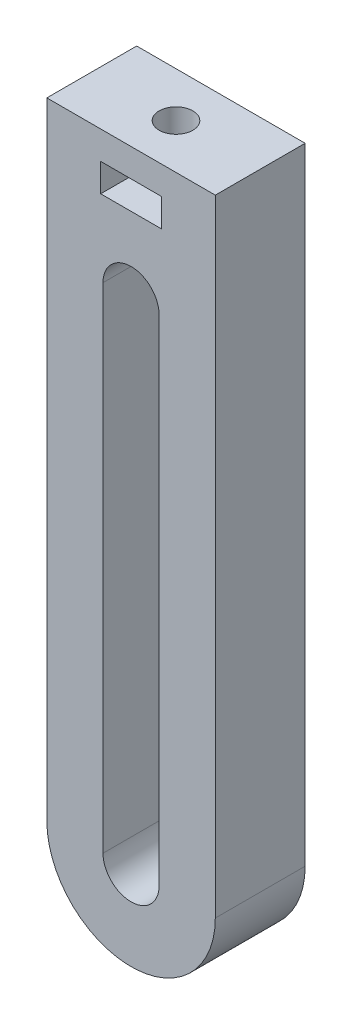
ISO-10303-21;
HEADER;
FILE_DESCRIPTION(('STEP AP214'),'2;1');
FILE_NAME('part.step','',(''),(''),'','','');
FILE_SCHEMA(('AUTOMOTIVE_DESIGN { 1 0 10303 214 1 1 1 1 }'));
ENDSEC;
DATA;
#1=APPLICATION_CONTEXT('core data for automotive mechanical design processes');
#2=APPLICATION_PROTOCOL_DEFINITION('international standard','automotive_design',2000,#1);
#3=PRODUCT_CONTEXT('',#1,'mechanical');
#4=PRODUCT('Part','Part','',(#3));
#5=PRODUCT_RELATED_PRODUCT_CATEGORY('part','',(#4));
#6=PRODUCT_DEFINITION_FORMATION('','',#4);
#7=PRODUCT_DEFINITION_CONTEXT('part definition',#1,'design');
#8=PRODUCT_DEFINITION('design','',#6,#7);
#9=PRODUCT_DEFINITION_SHAPE('','',#8);
#10=(LENGTH_UNIT() NAMED_UNIT(*) SI_UNIT(.MILLI.,.METRE.));
#11=(NAMED_UNIT(*) PLANE_ANGLE_UNIT() SI_UNIT($,.RADIAN.));
#12=(NAMED_UNIT(*) SI_UNIT($,.STERADIAN.) SOLID_ANGLE_UNIT());
#13=UNCERTAINTY_MEASURE_WITH_UNIT(LENGTH_MEASURE(1.E-05),#10,'distance_accuracy_value','');
#14=(GEOMETRIC_REPRESENTATION_CONTEXT(3) GLOBAL_UNCERTAINTY_ASSIGNED_CONTEXT((#13)) GLOBAL_UNIT_ASSIGNED_CONTEXT((#10,
#11,#12)) REPRESENTATION_CONTEXT('',''));
#15=CARTESIAN_POINT('',(0.,0.,0.));
#16=DIRECTION('',(0.,0.,1.));
#17=DIRECTION('',(1.,0.,0.));
#18=AXIS2_PLACEMENT_3D('',#15,#16,#17);
#19=CARTESIAN_POINT('',(0.,-22.,8.));
#20=DIRECTION('',(0.,0.,-1.));
#21=DIRECTION('',(-1.,0.,0.));
#22=AXIS2_PLACEMENT_3D('',#19,#20,#21);
#23=PLANE('',#22);
#24=DIRECTION('',(-1.,0.,0.));
#25=VECTOR('',#24,1.);
#26=CARTESIAN_POINT('',(-2.70500000000001,31.25,8.));
#27=LINE('',#26,#25);
#28=CARTESIAN_POINT('',(2.70499999999999,31.25,8.));
#29=VERTEX_POINT('',#28);
#30=CARTESIAN_POINT('',(-2.70500000000001,31.25,8.));
#31=VERTEX_POINT('',#30);
#32=EDGE_CURVE('E142',#29,#31,#27,.T.);
#33=ORIENTED_EDGE('',*,*,#32,.F.);
#34=DIRECTION('',(0.,1.,0.));
#35=VECTOR('',#34,1.);
#36=CARTESIAN_POINT('',(2.70499999999999,31.25,8.));
#37=LINE('',#36,#35);
#38=CARTESIAN_POINT('',(2.70499999999999,28.75,8.));
#39=VERTEX_POINT('',#38);
#40=EDGE_CURVE('E146',#39,#29,#37,.T.);
#41=ORIENTED_EDGE('',*,*,#40,.F.);
#42=DIRECTION('',(1.,0.,0.));
#43=VECTOR('',#42,1.);
#44=CARTESIAN_POINT('',(-2.70500000000001,28.75,8.));
#45=LINE('',#44,#43);
#46=CARTESIAN_POINT('',(-2.70500000000001,28.75,8.));
#47=VERTEX_POINT('',#46);
#48=EDGE_CURVE('E150',#47,#39,#45,.T.);
#49=ORIENTED_EDGE('',*,*,#48,.F.);
#50=DIRECTION('',(0.,-1.,0.));
#51=VECTOR('',#50,1.);
#52=CARTESIAN_POINT('',(-2.70500000000001,31.25,8.));
#53=LINE('',#52,#51);
#54=EDGE_CURVE('E133',#31,#47,#53,.T.);
#55=ORIENTED_EDGE('',*,*,#54,.F.);
#56=EDGE_LOOP('',(#33,#41,#49,#55));
#57=FACE_BOUND('',#56,.T.);
#58=DIRECTION('',(0.,1.,0.));
#59=VECTOR('',#58,1.);
#60=CARTESIAN_POINT('',(7.5,-22.,8.));
#61=LINE('',#60,#59);
#62=CARTESIAN_POINT('',(7.5,-22.,8.));
#63=VERTEX_POINT('',#62);
#64=CARTESIAN_POINT('',(7.5,33.75,8.));
#65=VERTEX_POINT('',#64);
#66=EDGE_CURVE('E205',#63,#65,#61,.T.);
#67=ORIENTED_EDGE('',*,*,#66,.T.);
#68=DIRECTION('',(-1.,0.,0.));
#69=VECTOR('',#68,1.);
#70=CARTESIAN_POINT('',(-7.5,33.75,8.));
#71=LINE('',#70,#69);
#72=CARTESIAN_POINT('',(-7.5,33.75,8.));
#73=VERTEX_POINT('',#72);
#74=EDGE_CURVE('E208',#65,#73,#71,.T.);
#75=ORIENTED_EDGE('',*,*,#74,.T.);
#76=DIRECTION('',(0.,-1.,0.));
#77=VECTOR('',#76,1.);
#78=CARTESIAN_POINT('',(-7.5,33.75,8.));
#79=LINE('',#78,#77);
#80=CARTESIAN_POINT('',(-7.5,-22.,8.));
#81=VERTEX_POINT('',#80);
#82=EDGE_CURVE('E211',#73,#81,#79,.T.);
#83=ORIENTED_EDGE('',*,*,#82,.T.);
#84=CARTESIAN_POINT('',(0.,-22.,8.));
#85=DIRECTION('',(0.,0.,1.));
#86=DIRECTION('',(-1.,0.,0.));
#87=AXIS2_PLACEMENT_3D('',#84,#85,#86);
#88=CIRCLE('',#87,7.5);
#89=EDGE_CURVE('E213',#81,#63,#88,.T.);
#90=ORIENTED_EDGE('',*,*,#89,.T.);
#91=EDGE_LOOP('',(#67,#75,#83,#90));
#92=FACE_BOUND('',#91,.T.);
#93=CARTESIAN_POINT('',(0.,22.,8.));
#94=DIRECTION('',(0.,0.,1.));
#95=DIRECTION('',(1.,0.,0.));
#96=AXIS2_PLACEMENT_3D('',#93,#94,#95);
#97=CIRCLE('',#96,2.49999999999999);
#98=CARTESIAN_POINT('',(2.49999999999998,22.,8.));
#99=VERTEX_POINT('',#98);
#100=CARTESIAN_POINT('',(-2.5,22.,8.));
#101=VERTEX_POINT('',#100);
#102=EDGE_CURVE('E176',#99,#101,#97,.T.);
#103=ORIENTED_EDGE('',*,*,#102,.F.);
#104=DIRECTION('',(0.,1.,0.));
#105=VECTOR('',#104,1.);
#106=CARTESIAN_POINT('',(2.49999999999998,22.,8.));
#107=LINE('',#106,#105);
#108=CARTESIAN_POINT('',(2.5,-22.,8.));
#109=VERTEX_POINT('',#108);
#110=EDGE_CURVE('E183',#109,#99,#107,.T.);
#111=ORIENTED_EDGE('',*,*,#110,.F.);
#112=CARTESIAN_POINT('',(0.,-22.,8.));
#113=DIRECTION('',(0.,0.,1.));
#114=DIRECTION('',(1.,0.,0.));
#115=AXIS2_PLACEMENT_3D('',#112,#113,#114);
#116=CIRCLE('',#115,2.49999999999999);
#117=CARTESIAN_POINT('',(-2.49999999999999,-22.,8.));
#118=VERTEX_POINT('',#117);
#119=EDGE_CURVE('E181',#118,#109,#116,.T.);
#120=ORIENTED_EDGE('',*,*,#119,.F.);
#121=DIRECTION('',(0.,-1.,0.));
#122=VECTOR('',#121,1.);
#123=CARTESIAN_POINT('',(-2.5,22.,8.));
#124=LINE('',#123,#122);
#125=EDGE_CURVE('E178',#101,#118,#124,.T.);
#126=ORIENTED_EDGE('',*,*,#125,.F.);
#127=EDGE_LOOP('',(#103,#111,#120,#126));
#128=FACE_BOUND('',#127,.T.);
#129=ADVANCED_FACE('F32',(#57,#92,#128),#23,.F.);
#130=CARTESIAN_POINT('',(0.,-22.,0.));
#131=DIRECTION('',(0.,0.,-1.));
#132=DIRECTION('',(-1.,0.,0.));
#133=AXIS2_PLACEMENT_3D('',#130,#131,#132);
#134=PLANE('',#133);
#135=DIRECTION('',(0.,1.,0.));
#136=VECTOR('',#135,1.);
#137=CARTESIAN_POINT('',(7.5,-22.,0.));
#138=LINE('',#137,#136);
#139=CARTESIAN_POINT('',(7.5,-22.,0.));
#140=VERTEX_POINT('',#139);
#141=CARTESIAN_POINT('',(7.5,33.75,0.));
#142=VERTEX_POINT('',#141);
#143=EDGE_CURVE('E204',#140,#142,#138,.T.);
#144=ORIENTED_EDGE('',*,*,#143,.F.);
#145=CARTESIAN_POINT('',(0.,-22.,0.));
#146=DIRECTION('',(0.,0.,1.));
#147=DIRECTION('',(-1.,0.,0.));
#148=AXIS2_PLACEMENT_3D('',#145,#146,#147);
#149=CIRCLE('',#148,7.5);
#150=CARTESIAN_POINT('',(-7.5,-22.,0.));
#151=VERTEX_POINT('',#150);
#152=EDGE_CURVE('E209',#151,#140,#149,.T.);
#153=ORIENTED_EDGE('',*,*,#152,.F.);
#154=DIRECTION('',(0.,-1.,0.));
#155=VECTOR('',#154,1.);
#156=CARTESIAN_POINT('',(-7.5,33.75,0.));
#157=LINE('',#156,#155);
#158=CARTESIAN_POINT('',(-7.5,33.75,0.));
#159=VERTEX_POINT('',#158);
#160=EDGE_CURVE('E220',#159,#151,#157,.T.);
#161=ORIENTED_EDGE('',*,*,#160,.F.);
#162=DIRECTION('',(-1.,0.,0.));
#163=VECTOR('',#162,1.);
#164=CARTESIAN_POINT('',(-7.5,33.75,0.));
#165=LINE('',#164,#163);
#166=EDGE_CURVE('E218',#142,#159,#165,.T.);
#167=ORIENTED_EDGE('',*,*,#166,.F.);
#168=EDGE_LOOP('',(#144,#153,#161,#167));
#169=FACE_BOUND('',#168,.T.);
#170=DIRECTION('',(0.,1.,0.));
#171=VECTOR('',#170,1.);
#172=CARTESIAN_POINT('',(2.49999999999998,22.,0.));
#173=LINE('',#172,#171);
#174=CARTESIAN_POINT('',(2.5,-22.,0.));
#175=VERTEX_POINT('',#174);
#176=CARTESIAN_POINT('',(2.49999999999998,22.,0.));
#177=VERTEX_POINT('',#176);
#178=EDGE_CURVE('E179',#175,#177,#173,.T.);
#179=ORIENTED_EDGE('',*,*,#178,.T.);
#180=CARTESIAN_POINT('',(0.,22.,0.));
#181=DIRECTION('',(0.,0.,1.));
#182=DIRECTION('',(1.,0.,0.));
#183=AXIS2_PLACEMENT_3D('',#180,#181,#182);
#184=CIRCLE('',#183,2.49999999999999);
#185=CARTESIAN_POINT('',(-2.5,22.,0.));
#186=VERTEX_POINT('',#185);
#187=EDGE_CURVE('E171',#177,#186,#184,.T.);
#188=ORIENTED_EDGE('',*,*,#187,.T.);
#189=DIRECTION('',(0.,-1.,0.));
#190=VECTOR('',#189,1.);
#191=CARTESIAN_POINT('',(-2.5,22.,0.));
#192=LINE('',#191,#190);
#193=CARTESIAN_POINT('',(-2.49999999999999,-22.,0.));
#194=VERTEX_POINT('',#193);
#195=EDGE_CURVE('E188',#186,#194,#192,.T.);
#196=ORIENTED_EDGE('',*,*,#195,.T.);
#197=CARTESIAN_POINT('',(0.,-22.,0.));
#198=DIRECTION('',(0.,0.,1.));
#199=DIRECTION('',(1.,0.,0.));
#200=AXIS2_PLACEMENT_3D('',#197,#198,#199);
#201=CIRCLE('',#200,2.49999999999999);
#202=EDGE_CURVE('E191',#194,#175,#201,.T.);
#203=ORIENTED_EDGE('',*,*,#202,.T.);
#204=EDGE_LOOP('',(#179,#188,#196,#203));
#205=FACE_BOUND('',#204,.T.);
#206=ADVANCED_FACE('F239',(#169,#205),#134,.T.);
#207=CARTESIAN_POINT('',(7.5,-22.,8.));
#208=DIRECTION('',(-1.,0.,0.));
#209=DIRECTION('',(0.,0.,1.));
#210=AXIS2_PLACEMENT_3D('',#207,#208,#209);
#211=PLANE('',#210);
#212=ORIENTED_EDGE('',*,*,#143,.T.);
#213=DIRECTION('',(0.,0.,-1.));
#214=VECTOR('',#213,1.);
#215=CARTESIAN_POINT('',(7.5,33.75,8.));
#216=LINE('',#215,#214);
#217=EDGE_CURVE('E11',#65,#142,#216,.T.);
#218=ORIENTED_EDGE('',*,*,#217,.F.);
#219=ORIENTED_EDGE('',*,*,#66,.F.);
#220=DIRECTION('',(0.,0.,-1.));
#221=VECTOR('',#220,1.);
#222=CARTESIAN_POINT('',(7.5,-22.,8.));
#223=LINE('',#222,#221);
#224=EDGE_CURVE('E215',#63,#140,#223,.T.);
#225=ORIENTED_EDGE('',*,*,#224,.T.);
#226=EDGE_LOOP('',(#212,#218,#219,#225));
#227=FACE_BOUND('',#226,.T.);
#228=ADVANCED_FACE('F34',(#227),#211,.F.);
#229=CARTESIAN_POINT('',(-7.5,33.75,8.));
#230=DIRECTION('',(0.,-1.,0.));
#231=DIRECTION('',(0.,0.,-1.));
#232=AXIS2_PLACEMENT_3D('',#229,#230,#231);
#233=PLANE('',#232);
#234=CARTESIAN_POINT('',(0.,33.75,4.));
#235=DIRECTION('',(0.,1.,0.));
#236=DIRECTION('',(0.,0.,1.));
#237=AXIS2_PLACEMENT_3D('',#234,#235,#236);
#238=CIRCLE('',#237,1.5);
#239=CARTESIAN_POINT('',(0.,33.75,5.5));
#240=VERTEX_POINT('',#239);
#241=EDGE_CURVE('E332',#240,#240,#238,.T.);
#242=ORIENTED_EDGE('',*,*,#241,.F.);
#243=EDGE_LOOP('',(#242));
#244=FACE_BOUND('',#243,.T.);
#245=ORIENTED_EDGE('',*,*,#166,.T.);
#246=DIRECTION('',(0.,0.,-1.));
#247=VECTOR('',#246,1.);
#248=CARTESIAN_POINT('',(-7.5,33.75,8.));
#249=LINE('',#248,#247);
#250=EDGE_CURVE('E41',#73,#159,#249,.T.);
#251=ORIENTED_EDGE('',*,*,#250,.F.);
#252=ORIENTED_EDGE('',*,*,#74,.F.);
#253=ORIENTED_EDGE('',*,*,#217,.T.);
#254=EDGE_LOOP('',(#245,#251,#252,#253));
#255=FACE_BOUND('',#254,.T.);
#256=ADVANCED_FACE('F249',(#244,#255),#233,.F.);
#257=CARTESIAN_POINT('',(-7.5,33.75,8.));
#258=DIRECTION('',(1.,0.,0.));
#259=DIRECTION('',(0.,0.,-1.));
#260=AXIS2_PLACEMENT_3D('',#257,#258,#259);
#261=PLANE('',#260);
#262=ORIENTED_EDGE('',*,*,#160,.T.);
#263=DIRECTION('',(0.,0.,-1.));
#264=VECTOR('',#263,1.);
#265=CARTESIAN_POINT('',(-7.5,-22.,8.));
#266=LINE('',#265,#264);
#267=EDGE_CURVE('E225',#81,#151,#266,.T.);
#268=ORIENTED_EDGE('',*,*,#267,.F.);
#269=ORIENTED_EDGE('',*,*,#82,.F.);
#270=ORIENTED_EDGE('',*,*,#250,.T.);
#271=EDGE_LOOP('',(#262,#268,#269,#270));
#272=FACE_BOUND('',#271,.T.);
#273=ADVANCED_FACE('F233',(#272),#261,.F.);
#274=CARTESIAN_POINT('',(0.,-22.,8.));
#275=DIRECTION('',(0.,0.,-1.));
#276=DIRECTION('',(-1.,0.,0.));
#277=AXIS2_PLACEMENT_3D('',#274,#275,#276);
#278=CYLINDRICAL_SURFACE('',#277,7.5);
#279=ORIENTED_EDGE('',*,*,#152,.T.);
#280=ORIENTED_EDGE('',*,*,#224,.F.);
#281=ORIENTED_EDGE('',*,*,#89,.F.);
#282=ORIENTED_EDGE('',*,*,#267,.T.);
#283=EDGE_LOOP('',(#279,#280,#281,#282));
#284=FACE_BOUND('',#283,.T.);
#285=ADVANCED_FACE('F243',(#284),#278,.T.);
#286=CARTESIAN_POINT('',(0.,22.,8.));
#287=DIRECTION('',(0.,0.,-1.));
#288=DIRECTION('',(-1.,0.,0.));
#289=AXIS2_PLACEMENT_3D('',#286,#287,#288);
#290=CYLINDRICAL_SURFACE('',#289,2.49999999999999);
#291=CARTESIAN_POINT('',(0.,24.5,5.5));
#292=CARTESIAN_POINT('',(0.076729833462016,24.4999962578973,5.49999590899012));
#293=CARTESIAN_POINT('',(0.153582320644178,24.4964290461501,5.49407132907374));
#294=CARTESIAN_POINT('',(0.304975509530679,24.4824990360857,5.47067568048467));
#295=CARTESIAN_POINT('',(0.379510034596047,24.4721194803272,5.45317613814577));
#296=CARTESIAN_POINT('',(0.523751827790837,24.4456155805449,5.40761363883314));
#297=CARTESIAN_POINT('',(0.593481028226566,24.4295197327294,5.37960304183684));
#298=CARTESIAN_POINT('',(0.727030318214659,24.3929536762641,5.31413966685897));
#299=CARTESIAN_POINT('',(0.790851869416383,24.3724845538025,5.27668923303125));
#300=CARTESIAN_POINT('',(0.916299278999315,24.3270536071909,5.19022517329142));
#301=CARTESIAN_POINT('',(0.977384020081416,24.3018679219598,5.14054630464861));
#302=CARTESIAN_POINT('',(1.09088270411891,24.2503043927963,5.03253279617173));
#303=CARTESIAN_POINT('',(1.14328534948112,24.2239250515357,4.97418706281268));
#304=CARTESIAN_POINT('',(1.24444996762974,24.1691106699591,4.84207648950327));
#305=CARTESIAN_POINT('',(1.29197766378809,24.1408201770365,4.76729822901871));
#306=CARTESIAN_POINT('',(1.37361437764896,24.0893830141212,4.60915342675689));
#307=CARTESIAN_POINT('',(1.4077451733516,24.0662280227394,4.52580110375243));
#308=CARTESIAN_POINT('',(1.45440601714221,24.0335462966093,4.37340354934676));
#309=CARTESIAN_POINT('',(1.47016197246826,24.0220788313759,4.30576400138969));
#310=CARTESIAN_POINT('',(1.49216172340475,24.005903082955,4.16819628416964));
#311=CARTESIAN_POINT('',(1.49841734556836,24.0011863964376,4.09827107124551));
#312=CARTESIAN_POINT('',(1.50105508796009,23.9992092246385,3.95798850578267));
#313=CARTESIAN_POINT('',(1.49741783408419,24.0019633701272,3.88763057490681));
#314=CARTESIAN_POINT('',(1.48046060478828,24.0145326144374,3.74872122457242));
#315=CARTESIAN_POINT('',(1.46713334620103,24.0243530243222,3.68017120415256));
#316=CARTESIAN_POINT('',(1.43173921881793,24.0495318694426,3.5474697578719));
#317=CARTESIAN_POINT('',(1.40978748666087,24.0648171165254,3.48327294607552));
#318=CARTESIAN_POINT('',(1.35795061770837,24.0992705135083,3.35930500907188));
#319=CARTESIAN_POINT('',(1.32806257259705,24.1184400862346,3.29953551657608));
#320=CARTESIAN_POINT('',(1.25517983184583,24.1625532726898,3.1750159028772));
#321=CARTESIAN_POINT('',(1.21080724397723,24.1879204337299,3.11122190704508));
#322=CARTESIAN_POINT('',(1.11291092784003,24.2393059976438,2.99132351633299));
#323=CARTESIAN_POINT('',(1.05937845100579,24.2653250026215,2.9352265660235));
#324=CARTESIAN_POINT('',(0.935811834382973,24.3193550495832,2.82438701817825));
#325=CARTESIAN_POINT('',(0.864517682704964,24.3471383626853,2.77092269398402));
#326=CARTESIAN_POINT('',(0.712276050459008,24.3977242843398,2.67687795280209));
#327=CARTESIAN_POINT('',(0.631333763943572,24.4205295542551,2.63629064621005));
#328=CARTESIAN_POINT('',(0.467197585268214,24.4573039206615,2.5720678172041));
#329=CARTESIAN_POINT('',(0.384467624173588,24.471739574397,2.54752464428409));
#330=CARTESIAN_POINT('',(0.215047895144647,24.4921884281355,2.51298880259462));
#331=CARTESIAN_POINT('',(0.128363005661326,24.4982117295274,2.50297868224643));
#332=CARTESIAN_POINT('',(-0.0337146143773894,24.5009057037461,2.49849215232169));
#333=CARTESIAN_POINT('',(-0.109042473418711,24.4987352171429,2.50209114491483));
#334=CARTESIAN_POINT('',(-0.257829401986054,24.4877871208705,2.52042585307192));
#335=CARTESIAN_POINT('',(-0.331288509376099,24.4790096451804,2.53516134280581));
#336=CARTESIAN_POINT('',(-0.472574932157607,24.4559479244219,2.57454343281246));
#337=CARTESIAN_POINT('',(-0.540495750928477,24.4418027566255,2.59894034907346));
#338=CARTESIAN_POINT('',(-0.671265749087256,24.4091388086284,2.65667737636527));
#339=CARTESIAN_POINT('',(-0.734113924963902,24.3906191658651,2.69001925134667));
#340=CARTESIAN_POINT('',(-0.860006262823858,24.3484549623736,2.7685569792087));
#341=CARTESIAN_POINT('',(-0.922394150456832,24.3244780273988,2.81462382907839));
#342=CARTESIAN_POINT('',(-1.03902603131013,24.2747426557473,2.91539139348861));
#343=CARTESIAN_POINT('',(-1.09326040273738,24.2489821658636,2.97010215485253));
#344=CARTESIAN_POINT('',(-1.19931996735579,24.1944542390989,3.09491039003715));
#345=CARTESIAN_POINT('',(-1.24991019630914,24.1657324174629,3.1660838854655));
#346=CARTESIAN_POINT('',(-1.33845238915667,24.1121618206671,3.3172160245682));
#347=CARTESIAN_POINT('',(-1.37641766769781,24.0873089799769,3.39716529389278));
#348=CARTESIAN_POINT('',(-1.43142578795776,24.0498490924052,3.54624302230668));
#349=CARTESIAN_POINT('',(-1.4512162533619,24.0357565932873,3.61398031235858));
#350=CARTESIAN_POINT('',(-1.48113663905971,24.0140960574354,3.7525320780801));
#351=CARTESIAN_POINT('',(-1.4912799529763,24.0065189764272,3.82334214432782));
#352=CARTESIAN_POINT('',(-1.50134130416631,23.9990044661627,3.96637694759702));
#353=CARTESIAN_POINT('',(-1.50122089107869,23.9990957644594,4.03860599068703));
#354=CARTESIAN_POINT('',(-1.49066472959328,24.0069771789285,4.18189443560945));
#355=CARTESIAN_POINT('',(-1.48022337215759,24.0147714813882,4.25295318008059));
#356=CARTESIAN_POINT('',(-1.45040174148913,24.0363318524298,4.38848841757218));
#357=CARTESIAN_POINT('',(-1.43147636845352,24.0497921180558,4.45311709430686));
#358=CARTESIAN_POINT('',(-1.38563242076993,24.0810550196015,4.57833725447421));
#359=CARTESIAN_POINT('',(-1.3587108358848,24.0988592904048,4.63892720696055));
#360=CARTESIAN_POINT('',(-1.29289245555733,24.1401299055092,4.76431985722077));
#361=CARTESIAN_POINT('',(-1.25279167675753,24.1640458758264,4.8283411038543));
#362=CARTESIAN_POINT('',(-1.16375698389085,24.2132012703077,4.94938007261728));
#363=CARTESIAN_POINT('',(-1.11481579607799,24.2384417720502,5.00639196215255));
#364=CARTESIAN_POINT('',(-1.00009777425735,24.2922569029148,5.12135094913167));
#365=CARTESIAN_POINT('',(-0.932876819313911,24.3207030866366,5.17793107489618));
#366=CARTESIAN_POINT('',(-0.788462434445597,24.3736542887237,5.2790978558633));
#367=CARTESIAN_POINT('',(-0.711265444501548,24.3981578931093,5.32368021198479));
#368=CARTESIAN_POINT('',(-0.551125230801463,24.4398557865439,5.39778580757373));
#369=CARTESIAN_POINT('',(-0.468430086957224,24.4572507747979,5.42772806492682));
#370=CARTESIAN_POINT('',(-0.297973306118818,24.4836627300125,5.47272469521097));
#371=CARTESIAN_POINT('',(-0.210232099648622,24.4927112587148,5.48783516785699));
#372=CARTESIAN_POINT('',(-0.101558096917544,24.4980200116819,5.49669745470866));
#373=CARTESIAN_POINT('',(-0.0812762590282831,24.4987611465636,5.4979344173061));
#374=CARTESIAN_POINT('',(-0.0406658206871149,24.4997516451737,5.49958624637086));
#375=CARTESIAN_POINT('',(-0.0203372186375707,24.5000009918431,5.5000010843209));
#376=CARTESIAN_POINT('',(0.,24.5,5.5));
#377=B_SPLINE_CURVE_WITH_KNOTS('',3,(#291,#292,#293,#294,#295,#296,#297,#298,#299,#300,#301,
#302,#303,#304,#305,#306,#307,#308,#309,#310,#311,#312,#313,#314,#315,#316,#317,#318,#319,#320,
#321,#322,#323,#324,#325,#326,#327,#328,#329,#330,#331,#332,#333,#334,#335,#336,#337,#338,#339,
#340,#341,#342,#343,#344,#345,#346,#347,#348,#349,#350,#351,#352,#353,#354,#355,#356,#357,#358,
#359,#360,#361,#362,#363,#364,#365,#366,#367,#368,#369,#370,#371,#372,#373,#374,#375,#376),
.UNSPECIFIED.,.T.,.F.,(4,2,2,2,2,2,2,2,2,2,2,2,2,2,2,2,2,2,2,2,2,2,2,2,2,2,2,2,2,2,2,2,2,2,2,2,
2,2,2,2,2,2,4),(0.,0.230102237548649,0.460772627520012,0.690308884600013,0.919788197992276,
1.16681590732473,1.41416257934801,1.69183813189807,1.96906040692092,2.17933829855633,
2.38935420916578,2.59978170870726,2.81036753273872,3.01823267593206,3.22617409809868,
3.47046995225162,3.71500044803673,3.9936095788469,4.27206939275323,4.53296790696559,
4.79355286918235,5.01875602722425,5.24395461863454,5.46367785689771,5.68344445659024,
5.92601365818361,6.16886690081835,6.44336762428008,6.71757792616455,6.93257787314691,
7.14727888733318,7.36278425777432,7.57840681155724,7.78364098331141,7.98895251523034,
8.22578610052285,8.46281544370207,8.73854311775518,9.01436946031984,9.28175654462675,
9.54812832184447,9.60911473335176,9.6701032602764),.UNSPECIFIED.);
#378=CARTESIAN_POINT('',(0.,24.5,5.5));
#379=VERTEX_POINT('',#378);
#380=EDGE_CURVE('E282',#379,#379,#377,.T.);
#381=ORIENTED_EDGE('',*,*,#380,.T.);
#382=EDGE_LOOP('',(#381));
#383=FACE_BOUND('',#382,.T.);
#384=ORIENTED_EDGE('',*,*,#187,.F.);
#385=DIRECTION('',(0.,0.,-1.));
#386=VECTOR('',#385,1.);
#387=CARTESIAN_POINT('',(2.49999999999998,22.,8.));
#388=LINE('',#387,#386);
#389=EDGE_CURVE('E185',#99,#177,#388,.T.);
#390=ORIENTED_EDGE('',*,*,#389,.F.);
#391=ORIENTED_EDGE('',*,*,#102,.T.);
#392=DIRECTION('',(0.,0.,-1.));
#393=VECTOR('',#392,1.);
#394=CARTESIAN_POINT('',(-2.5,22.,8.));
#395=LINE('',#394,#393);
#396=EDGE_CURVE('E201',#101,#186,#395,.T.);
#397=ORIENTED_EDGE('',*,*,#396,.T.);
#398=EDGE_LOOP('',(#384,#390,#391,#397));
#399=FACE_BOUND('',#398,.T.);
#400=ADVANCED_FACE('F265',(#383,#399),#290,.F.);
#401=CARTESIAN_POINT('',(-2.5,22.,8.));
#402=DIRECTION('',(1.,0.,0.));
#403=DIRECTION('',(0.,1.,0.));
#404=AXIS2_PLACEMENT_3D('',#401,#402,#403);
#405=PLANE('',#404);
#406=ORIENTED_EDGE('',*,*,#195,.F.);
#407=ORIENTED_EDGE('',*,*,#396,.F.);
#408=ORIENTED_EDGE('',*,*,#125,.T.);
#409=DIRECTION('',(0.,0.,-1.));
#410=VECTOR('',#409,1.);
#411=CARTESIAN_POINT('',(-2.49999999999999,-22.,8.));
#412=LINE('',#411,#410);
#413=EDGE_CURVE('E199',#118,#194,#412,.T.);
#414=ORIENTED_EDGE('',*,*,#413,.T.);
#415=EDGE_LOOP('',(#406,#407,#408,#414));
#416=FACE_BOUND('',#415,.T.);
#417=ADVANCED_FACE('F272',(#416),#405,.T.);
#418=CARTESIAN_POINT('',(0.,-22.,8.));
#419=DIRECTION('',(0.,0.,-1.));
#420=DIRECTION('',(-1.,0.,0.));
#421=AXIS2_PLACEMENT_3D('',#418,#419,#420);
#422=CYLINDRICAL_SURFACE('',#421,2.49999999999999);
#423=ORIENTED_EDGE('',*,*,#202,.F.);
#424=ORIENTED_EDGE('',*,*,#413,.F.);
#425=ORIENTED_EDGE('',*,*,#119,.T.);
#426=DIRECTION('',(0.,0.,-1.));
#427=VECTOR('',#426,1.);
#428=CARTESIAN_POINT('',(2.5,-22.,8.));
#429=LINE('',#428,#427);
#430=EDGE_CURVE('E56',#109,#175,#429,.T.);
#431=ORIENTED_EDGE('',*,*,#430,.T.);
#432=EDGE_LOOP('',(#423,#424,#425,#431));
#433=FACE_BOUND('',#432,.T.);
#434=ADVANCED_FACE('F277',(#433),#422,.F.);
#435=CARTESIAN_POINT('',(2.49999999999998,22.,8.));
#436=DIRECTION('',(-1.,0.,0.));
#437=DIRECTION('',(0.,-1.,0.));
#438=AXIS2_PLACEMENT_3D('',#435,#436,#437);
#439=PLANE('',#438);
#440=ORIENTED_EDGE('',*,*,#178,.F.);
#441=ORIENTED_EDGE('',*,*,#430,.F.);
#442=ORIENTED_EDGE('',*,*,#110,.T.);
#443=ORIENTED_EDGE('',*,*,#389,.T.);
#444=EDGE_LOOP('',(#440,#441,#442,#443));
#445=FACE_BOUND('',#444,.T.);
#446=ADVANCED_FACE('F286',(#445),#439,.T.);
#447=CARTESIAN_POINT('',(-2.705,28.75,2.43826752184206));
#448=DIRECTION('',(-1.,0.,0.));
#449=DIRECTION('',(0.,0.,1.));
#450=AXIS2_PLACEMENT_3D('',#447,#448,#449);
#451=PLANE('',#450);
#452=ORIENTED_EDGE('',*,*,#54,.T.);
#453=DIRECTION('',(0.,0.,1.));
#454=VECTOR('',#453,1.);
#455=CARTESIAN_POINT('',(-2.705,28.75,2.43826752184206));
#456=LINE('',#455,#454);
#457=CARTESIAN_POINT('',(-2.705,28.75,2.43826752184206));
#458=VERTEX_POINT('',#457);
#459=EDGE_CURVE('E162',#458,#47,#456,.T.);
#460=ORIENTED_EDGE('',*,*,#459,.F.);
#461=DIRECTION('',(0.,1.,0.));
#462=VECTOR('',#461,1.);
#463=CARTESIAN_POINT('',(-2.705,28.75,2.43826752184206));
#464=LINE('',#463,#462);
#465=CARTESIAN_POINT('',(-2.705,31.25,2.43826752184206));
#466=VERTEX_POINT('',#465);
#467=EDGE_CURVE('E135',#458,#466,#464,.T.);
#468=ORIENTED_EDGE('',*,*,#467,.T.);
#469=DIRECTION('',(0.,0.,1.));
#470=VECTOR('',#469,1.);
#471=CARTESIAN_POINT('',(-2.705,31.25,2.43826752184206));
#472=LINE('',#471,#470);
#473=EDGE_CURVE('E129',#466,#31,#472,.T.);
#474=ORIENTED_EDGE('',*,*,#473,.T.);
#475=EDGE_LOOP('',(#452,#460,#468,#474));
#476=FACE_BOUND('',#475,.T.);
#477=ADVANCED_FACE('F130',(#476),#451,.F.);
#478=CARTESIAN_POINT('',(0.,28.75,0.876535043684125));
#479=DIRECTION('',(-0.5,0.,-0.866025403784439));
#480=DIRECTION('',(-0.866025403784439,0.,0.5));
#481=AXIS2_PLACEMENT_3D('',#478,#479,#480);
#482=PLANE('',#481);
#483=DIRECTION('',(-0.866025403784439,0.,0.5));
#484=VECTOR('',#483,1.);
#485=CARTESIAN_POINT('',(0.,31.25,0.876535043684125));
#486=LINE('',#485,#484);
#487=CARTESIAN_POINT('',(0.,31.25,0.876535043684125));
#488=VERTEX_POINT('',#487);
#489=EDGE_CURVE('E139',#488,#466,#486,.T.);
#490=ORIENTED_EDGE('',*,*,#489,.T.);
#491=ORIENTED_EDGE('',*,*,#467,.F.);
#492=DIRECTION('',(-0.866025403784439,0.,0.5));
#493=VECTOR('',#492,1.);
#494=CARTESIAN_POINT('',(0.,28.75,0.876535043684125));
#495=LINE('',#494,#493);
#496=CARTESIAN_POINT('',(0.,28.75,0.876535043684125));
#497=VERTEX_POINT('',#496);
#498=EDGE_CURVE('E159',#497,#458,#495,.T.);
#499=ORIENTED_EDGE('',*,*,#498,.F.);
#500=DIRECTION('',(0.,1.,0.));
#501=VECTOR('',#500,1.);
#502=CARTESIAN_POINT('',(0.,28.75,0.876535043684125));
#503=LINE('',#502,#501);
#504=EDGE_CURVE('E172',#497,#488,#503,.T.);
#505=ORIENTED_EDGE('',*,*,#504,.T.);
#506=EDGE_LOOP('',(#490,#491,#499,#505));
#507=FACE_BOUND('',#506,.T.);
#508=ADVANCED_FACE('F308',(#507),#482,.F.);
#509=CARTESIAN_POINT('',(2.705,28.75,2.43826752184206));
#510=DIRECTION('',(0.5,0.,-0.866025403784439));
#511=DIRECTION('',(-0.866025403784439,0.,-0.5));
#512=AXIS2_PLACEMENT_3D('',#509,#510,#511);
#513=PLANE('',#512);
#514=DIRECTION('',(-0.866025403784438,0.,-0.5));
#515=VECTOR('',#514,1.);
#516=CARTESIAN_POINT('',(2.705,31.25,2.43826752184206));
#517=LINE('',#516,#515);
#518=CARTESIAN_POINT('',(2.705,31.25,2.43826752184206));
#519=VERTEX_POINT('',#518);
#520=EDGE_CURVE('E166',#519,#488,#517,.T.);
#521=ORIENTED_EDGE('',*,*,#520,.T.);
#522=ORIENTED_EDGE('',*,*,#504,.F.);
#523=DIRECTION('',(-0.866025403784438,0.,-0.5));
#524=VECTOR('',#523,1.);
#525=CARTESIAN_POINT('',(2.705,28.75,2.43826752184206));
#526=LINE('',#525,#524);
#527=CARTESIAN_POINT('',(2.705,28.75,2.43826752184206));
#528=VERTEX_POINT('',#527);
#529=EDGE_CURVE('E156',#528,#497,#526,.T.);
#530=ORIENTED_EDGE('',*,*,#529,.F.);
#531=DIRECTION('',(0.,1.,0.));
#532=VECTOR('',#531,1.);
#533=CARTESIAN_POINT('',(2.705,28.75,2.43826752184206));
#534=LINE('',#533,#532);
#535=EDGE_CURVE('E164',#528,#519,#534,.T.);
#536=ORIENTED_EDGE('',*,*,#535,.T.);
#537=EDGE_LOOP('',(#521,#522,#530,#536));
#538=FACE_BOUND('',#537,.T.);
#539=ADVANCED_FACE('F304',(#538),#513,.F.);
#540=CARTESIAN_POINT('',(2.705,28.75,5.56173247815794));
#541=DIRECTION('',(1.,0.,0.));
#542=DIRECTION('',(0.,0.,-1.));
#543=AXIS2_PLACEMENT_3D('',#540,#541,#542);
#544=PLANE('',#543);
#545=DIRECTION('',(0.,0.,-1.));
#546=VECTOR('',#545,1.);
#547=CARTESIAN_POINT('',(2.705,31.25,5.56173247815794));
#548=LINE('',#547,#546);
#549=EDGE_CURVE('E48',#29,#519,#548,.T.);
#550=ORIENTED_EDGE('',*,*,#549,.T.);
#551=ORIENTED_EDGE('',*,*,#535,.F.);
#552=DIRECTION('',(0.,0.,-1.));
#553=VECTOR('',#552,1.);
#554=CARTESIAN_POINT('',(2.705,28.75,5.56173247815794));
#555=LINE('',#554,#553);
#556=EDGE_CURVE('E138',#39,#528,#555,.T.);
#557=ORIENTED_EDGE('',*,*,#556,.F.);
#558=ORIENTED_EDGE('',*,*,#40,.T.);
#559=EDGE_LOOP('',(#550,#551,#557,#558));
#560=FACE_BOUND('',#559,.T.);
#561=ADVANCED_FACE('F300',(#560),#544,.F.);
#562=CARTESIAN_POINT('',(0.,28.75,0.));
#563=DIRECTION('',(0.,1.,0.));
#564=DIRECTION('',(0.,0.,1.));
#565=AXIS2_PLACEMENT_3D('',#562,#563,#564);
#566=PLANE('',#565);
#567=CARTESIAN_POINT('',(0.,28.75,4.));
#568=DIRECTION('',(0.,1.,0.));
#569=DIRECTION('',(0.,0.,1.));
#570=AXIS2_PLACEMENT_3D('',#567,#568,#569);
#571=CIRCLE('',#570,1.5);
#572=CARTESIAN_POINT('',(0.,28.75,5.5));
#573=VERTEX_POINT('',#572);
#574=EDGE_CURVE('E333',#573,#573,#571,.T.);
#575=ORIENTED_EDGE('',*,*,#574,.F.);
#576=EDGE_LOOP('',(#575));
#577=FACE_BOUND('',#576,.T.);
#578=ORIENTED_EDGE('',*,*,#556,.T.);
#579=ORIENTED_EDGE('',*,*,#529,.T.);
#580=ORIENTED_EDGE('',*,*,#498,.T.);
#581=ORIENTED_EDGE('',*,*,#459,.T.);
#582=ORIENTED_EDGE('',*,*,#48,.T.);
#583=EDGE_LOOP('',(#578,#579,#580,#581,#582));
#584=FACE_BOUND('',#583,.T.);
#585=ADVANCED_FACE('F303',(#577,#584),#566,.T.);
#586=CARTESIAN_POINT('',(0.,31.25,0.));
#587=DIRECTION('',(0.,1.,0.));
#588=DIRECTION('',(0.,0.,1.));
#589=AXIS2_PLACEMENT_3D('',#586,#587,#588);
#590=PLANE('',#589);
#591=CARTESIAN_POINT('',(0.,31.25,4.));
#592=DIRECTION('',(0.,1.,0.));
#593=DIRECTION('',(0.,0.,1.));
#594=AXIS2_PLACEMENT_3D('',#591,#592,#593);
#595=CIRCLE('',#594,1.5);
#596=CARTESIAN_POINT('',(0.,31.25,5.5));
#597=VERTEX_POINT('',#596);
#598=EDGE_CURVE('E36',#597,#597,#595,.T.);
#599=ORIENTED_EDGE('',*,*,#598,.T.);
#600=EDGE_LOOP('',(#599));
#601=FACE_BOUND('',#600,.T.);
#602=ORIENTED_EDGE('',*,*,#32,.T.);
#603=ORIENTED_EDGE('',*,*,#473,.F.);
#604=ORIENTED_EDGE('',*,*,#489,.F.);
#605=ORIENTED_EDGE('',*,*,#520,.F.);
#606=ORIENTED_EDGE('',*,*,#549,.F.);
#607=EDGE_LOOP('',(#602,#603,#604,#605,#606));
#608=FACE_BOUND('',#607,.T.);
#609=ADVANCED_FACE('F143',(#601,#608),#590,.F.);
#610=CARTESIAN_POINT('',(0.,-29.501,4.));
#611=DIRECTION('',(0.,1.,0.));
#612=DIRECTION('',(0.,0.,1.));
#613=AXIS2_PLACEMENT_3D('',#610,#611,#612);
#614=CYLINDRICAL_SURFACE('',#613,1.5);
#615=ORIENTED_EDGE('',*,*,#241,.T.);
#616=EDGE_LOOP('',(#615));
#617=FACE_BOUND('',#616,.T.);
#618=ORIENTED_EDGE('',*,*,#598,.F.);
#619=EDGE_LOOP('',(#618));
#620=FACE_BOUND('',#619,.T.);
#621=ADVANCED_FACE('F317',(#617,#620),#614,.F.);
#622=ORIENTED_EDGE('',*,*,#574,.T.);
#623=EDGE_LOOP('',(#622));
#624=FACE_BOUND('',#623,.T.);
#625=ORIENTED_EDGE('',*,*,#380,.F.);
#626=EDGE_LOOP('',(#625));
#627=FACE_BOUND('',#626,.T.);
#628=ADVANCED_FACE('F324',(#624,#627),#614,.F.);
#629=CLOSED_SHELL('',(#129,#206,#228,#256,#273,#285,#400,#417,#434,#446,#477,#508,#539,#561,
#585,#609,#621,#628));
#630=MANIFOLD_SOLID_BREP('B2',#629);
#631=ADVANCED_BREP_SHAPE_REPRESENTATION('',(#18,#630),#14);
#632=SHAPE_DEFINITION_REPRESENTATION(#9,#631);
ENDSEC;
END-ISO-10303-21;
